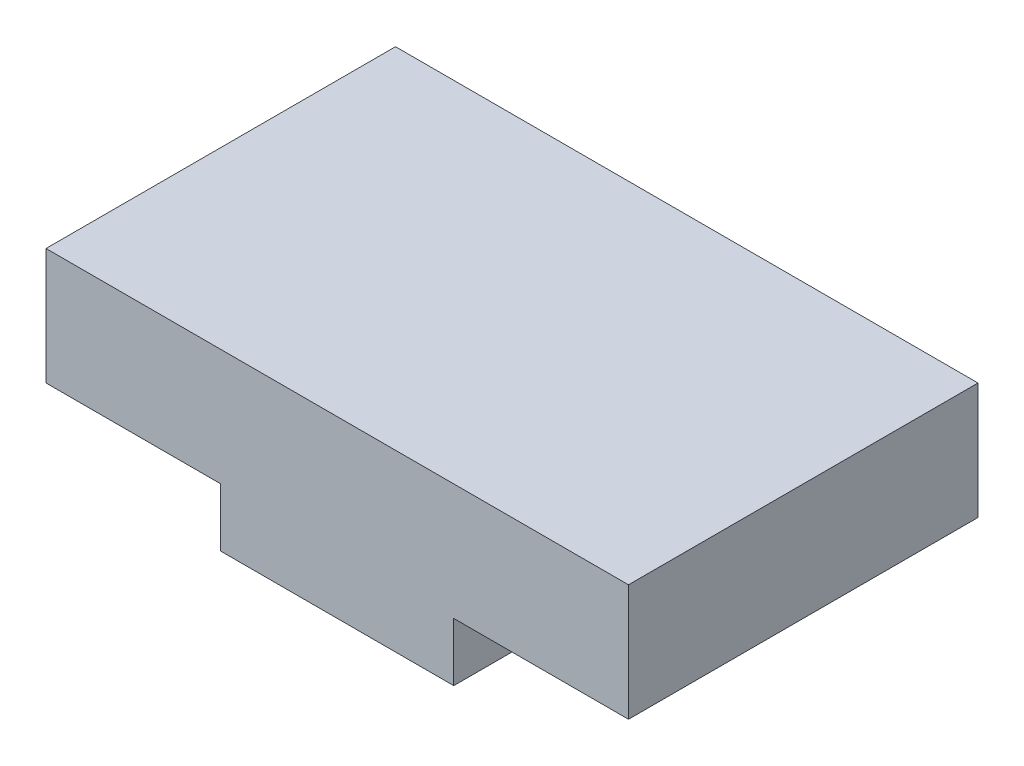
ISO-10303-21;
HEADER;
FILE_DESCRIPTION(('STEP AP214'),'2;1');
FILE_NAME('part.step','',(''),(''),'','','');
FILE_SCHEMA(('AUTOMOTIVE_DESIGN { 1 0 10303 214 1 1 1 1 }'));
ENDSEC;
DATA;
#1=APPLICATION_CONTEXT('core data for automotive mechanical design processes');
#2=APPLICATION_PROTOCOL_DEFINITION('international standard','automotive_design',2000,#1);
#3=PRODUCT_CONTEXT('',#1,'mechanical');
#4=PRODUCT('Part','Part','',(#3));
#5=PRODUCT_RELATED_PRODUCT_CATEGORY('part','',(#4));
#6=PRODUCT_DEFINITION_FORMATION('','',#4);
#7=PRODUCT_DEFINITION_CONTEXT('part definition',#1,'design');
#8=PRODUCT_DEFINITION('design','',#6,#7);
#9=PRODUCT_DEFINITION_SHAPE('','',#8);
#10=(LENGTH_UNIT() NAMED_UNIT(*) SI_UNIT(.MILLI.,.METRE.));
#11=(NAMED_UNIT(*) PLANE_ANGLE_UNIT() SI_UNIT($,.RADIAN.));
#12=(NAMED_UNIT(*) SI_UNIT($,.STERADIAN.) SOLID_ANGLE_UNIT());
#13=UNCERTAINTY_MEASURE_WITH_UNIT(LENGTH_MEASURE(1.E-05),#10,'distance_accuracy_value','');
#14=(GEOMETRIC_REPRESENTATION_CONTEXT(3) GLOBAL_UNCERTAINTY_ASSIGNED_CONTEXT((#13)) GLOBAL_UNIT_ASSIGNED_CONTEXT((#10,
#11,#12)) REPRESENTATION_CONTEXT('',''));
#15=CARTESIAN_POINT('',(0.,0.,0.));
#16=DIRECTION('',(0.,0.,1.));
#17=DIRECTION('',(1.,0.,0.));
#18=AXIS2_PLACEMENT_3D('',#15,#16,#17);
#19=CARTESIAN_POINT('',(25.,5.,15.));
#20=DIRECTION('',(-1.,0.,0.));
#21=DIRECTION('',(0.,0.,1.));
#22=AXIS2_PLACEMENT_3D('',#19,#20,#21);
#23=PLANE('',#22);
#24=DIRECTION('',(0.,1.,0.));
#25=VECTOR('',#24,1.);
#26=CARTESIAN_POINT('',(25.,5.,-15.));
#27=LINE('',#26,#25);
#28=CARTESIAN_POINT('',(25.,-5.,-15.));
#29=VERTEX_POINT('',#28);
#30=CARTESIAN_POINT('',(25.,5.,-15.));
#31=VERTEX_POINT('',#30);
#32=EDGE_CURVE('E140',#29,#31,#27,.T.);
#33=ORIENTED_EDGE('',*,*,#32,.T.);
#34=DIRECTION('',(0.,0.,-1.));
#35=VECTOR('',#34,1.);
#36=CARTESIAN_POINT('',(25.,5.,15.));
#37=LINE('',#36,#35);
#38=CARTESIAN_POINT('',(25.,5.,15.));
#39=VERTEX_POINT('',#38);
#40=EDGE_CURVE('E11',#39,#31,#37,.T.);
#41=ORIENTED_EDGE('',*,*,#40,.F.);
#42=DIRECTION('',(0.,1.,0.));
#43=VECTOR('',#42,1.);
#44=CARTESIAN_POINT('',(25.,5.,15.));
#45=LINE('',#44,#43);
#46=CARTESIAN_POINT('',(25.,-5.,15.));
#47=VERTEX_POINT('',#46);
#48=EDGE_CURVE('E162',#47,#39,#45,.T.);
#49=ORIENTED_EDGE('',*,*,#48,.F.);
#50=DIRECTION('',(0.,0.,-1.));
#51=VECTOR('',#50,1.);
#52=CARTESIAN_POINT('',(25.,-5.,15.));
#53=LINE('',#52,#51);
#54=EDGE_CURVE('E136',#47,#29,#53,.T.);
#55=ORIENTED_EDGE('',*,*,#54,.T.);
#56=EDGE_LOOP('',(#33,#41,#49,#55));
#57=FACE_BOUND('',#56,.T.);
#58=ADVANCED_FACE('F39',(#57),#23,.F.);
#59=CARTESIAN_POINT('',(-25.,5.,15.));
#60=DIRECTION('',(0.,-1.,0.));
#61=DIRECTION('',(0.,0.,-1.));
#62=AXIS2_PLACEMENT_3D('',#59,#60,#61);
#63=PLANE('',#62);
#64=DIRECTION('',(-1.,0.,0.));
#65=VECTOR('',#64,1.);
#66=CARTESIAN_POINT('',(-25.,5.,-15.));
#67=LINE('',#66,#65);
#68=CARTESIAN_POINT('',(-25.,5.,-15.));
#69=VERTEX_POINT('',#68);
#70=EDGE_CURVE('E144',#31,#69,#67,.T.);
#71=ORIENTED_EDGE('',*,*,#70,.T.);
#72=DIRECTION('',(0.,0.,-1.));
#73=VECTOR('',#72,1.);
#74=CARTESIAN_POINT('',(-25.,5.,15.));
#75=LINE('',#74,#73);
#76=CARTESIAN_POINT('',(-25.,5.,15.));
#77=VERTEX_POINT('',#76);
#78=EDGE_CURVE('E48',#77,#69,#75,.T.);
#79=ORIENTED_EDGE('',*,*,#78,.F.);
#80=DIRECTION('',(-1.,0.,0.));
#81=VECTOR('',#80,1.);
#82=CARTESIAN_POINT('',(-25.,5.,15.));
#83=LINE('',#82,#81);
#84=EDGE_CURVE('E99',#39,#77,#83,.T.);
#85=ORIENTED_EDGE('',*,*,#84,.F.);
#86=ORIENTED_EDGE('',*,*,#40,.T.);
#87=EDGE_LOOP('',(#71,#79,#85,#86));
#88=FACE_BOUND('',#87,.T.);
#89=ADVANCED_FACE('F208',(#88),#63,.F.);
#90=CARTESIAN_POINT('',(-25.,5.,15.));
#91=DIRECTION('',(1.,0.,0.));
#92=DIRECTION('',(0.,0.,-1.));
#93=AXIS2_PLACEMENT_3D('',#90,#91,#92);
#94=PLANE('',#93);
#95=DIRECTION('',(0.,-1.,0.));
#96=VECTOR('',#95,1.);
#97=CARTESIAN_POINT('',(-25.,5.,-15.));
#98=LINE('',#97,#96);
#99=CARTESIAN_POINT('',(-25.,-5.,-15.));
#100=VERTEX_POINT('',#99);
#101=EDGE_CURVE('E147',#69,#100,#98,.T.);
#102=ORIENTED_EDGE('',*,*,#101,.T.);
#103=DIRECTION('',(0.,0.,-1.));
#104=VECTOR('',#103,1.);
#105=CARTESIAN_POINT('',(-25.,-5.,15.));
#106=LINE('',#105,#104);
#107=CARTESIAN_POINT('',(-25.,-5.,15.));
#108=VERTEX_POINT('',#107);
#109=EDGE_CURVE('E173',#108,#100,#106,.T.);
#110=ORIENTED_EDGE('',*,*,#109,.F.);
#111=DIRECTION('',(0.,-1.,0.));
#112=VECTOR('',#111,1.);
#113=CARTESIAN_POINT('',(-25.,5.,15.));
#114=LINE('',#113,#112);
#115=EDGE_CURVE('E183',#77,#108,#114,.T.);
#116=ORIENTED_EDGE('',*,*,#115,.F.);
#117=ORIENTED_EDGE('',*,*,#78,.T.);
#118=EDGE_LOOP('',(#102,#110,#116,#117));
#119=FACE_BOUND('',#118,.T.);
#120=ADVANCED_FACE('F181',(#119),#94,.F.);
#121=CARTESIAN_POINT('',(-25.,-5.,15.));
#122=DIRECTION('',(0.,1.,0.));
#123=DIRECTION('',(0.,0.,1.));
#124=AXIS2_PLACEMENT_3D('',#121,#122,#123);
#125=PLANE('',#124);
#126=DIRECTION('',(1.,0.,0.));
#127=VECTOR('',#126,1.);
#128=CARTESIAN_POINT('',(-25.,-5.,-15.));
#129=LINE('',#128,#127);
#130=CARTESIAN_POINT('',(-10.,-5.,-15.));
#131=VERTEX_POINT('',#130);
#132=EDGE_CURVE('E150',#100,#131,#129,.T.);
#133=ORIENTED_EDGE('',*,*,#132,.T.);
#134=DIRECTION('',(0.,0.,-1.));
#135=VECTOR('',#134,1.);
#136=CARTESIAN_POINT('',(-10.,-5.,15.));
#137=LINE('',#136,#135);
#138=CARTESIAN_POINT('',(-10.,-5.,15.));
#139=VERTEX_POINT('',#138);
#140=EDGE_CURVE('E169',#139,#131,#137,.T.);
#141=ORIENTED_EDGE('',*,*,#140,.F.);
#142=DIRECTION('',(1.,0.,0.));
#143=VECTOR('',#142,1.);
#144=CARTESIAN_POINT('',(-25.,-5.,15.));
#145=LINE('',#144,#143);
#146=EDGE_CURVE('E196',#108,#139,#145,.T.);
#147=ORIENTED_EDGE('',*,*,#146,.F.);
#148=ORIENTED_EDGE('',*,*,#109,.T.);
#149=EDGE_LOOP('',(#133,#141,#147,#148));
#150=FACE_BOUND('',#149,.T.);
#151=ADVANCED_FACE('F191',(#150),#125,.F.);
#152=CARTESIAN_POINT('',(-10.,-5.,15.));
#153=DIRECTION('',(1.,0.,0.));
#154=DIRECTION('',(0.,0.,-1.));
#155=AXIS2_PLACEMENT_3D('',#152,#153,#154);
#156=PLANE('',#155);
#157=DIRECTION('',(0.,-1.,0.));
#158=VECTOR('',#157,1.);
#159=CARTESIAN_POINT('',(-10.,-5.,-15.));
#160=LINE('',#159,#158);
#161=CARTESIAN_POINT('',(-10.,-10.,-15.));
#162=VERTEX_POINT('',#161);
#163=EDGE_CURVE('E153',#131,#162,#160,.T.);
#164=ORIENTED_EDGE('',*,*,#163,.T.);
#165=DIRECTION('',(0.,0.,-1.));
#166=VECTOR('',#165,1.);
#167=CARTESIAN_POINT('',(-10.,-10.,15.));
#168=LINE('',#167,#166);
#169=CARTESIAN_POINT('',(-10.,-10.,15.));
#170=VERTEX_POINT('',#169);
#171=EDGE_CURVE('E129',#170,#162,#168,.T.);
#172=ORIENTED_EDGE('',*,*,#171,.F.);
#173=DIRECTION('',(0.,-1.,0.));
#174=VECTOR('',#173,1.);
#175=CARTESIAN_POINT('',(-10.,-5.,15.));
#176=LINE('',#175,#174);
#177=EDGE_CURVE('E118',#139,#170,#176,.T.);
#178=ORIENTED_EDGE('',*,*,#177,.F.);
#179=ORIENTED_EDGE('',*,*,#140,.T.);
#180=EDGE_LOOP('',(#164,#172,#178,#179));
#181=FACE_BOUND('',#180,.T.);
#182=ADVANCED_FACE('F194',(#181),#156,.F.);
#183=CARTESIAN_POINT('',(-10.,-10.,15.));
#184=DIRECTION('',(0.,1.,0.));
#185=DIRECTION('',(0.,0.,1.));
#186=AXIS2_PLACEMENT_3D('',#183,#184,#185);
#187=PLANE('',#186);
#188=DIRECTION('',(1.,0.,0.));
#189=VECTOR('',#188,1.);
#190=CARTESIAN_POINT('',(-10.,-10.,-15.));
#191=LINE('',#190,#189);
#192=CARTESIAN_POINT('',(10.,-10.,-15.));
#193=VERTEX_POINT('',#192);
#194=EDGE_CURVE('E127',#162,#193,#191,.T.);
#195=ORIENTED_EDGE('',*,*,#194,.T.);
#196=DIRECTION('',(0.,0.,-1.));
#197=VECTOR('',#196,1.);
#198=CARTESIAN_POINT('',(10.,-10.,15.));
#199=LINE('',#198,#197);
#200=CARTESIAN_POINT('',(10.,-10.,15.));
#201=VERTEX_POINT('',#200);
#202=EDGE_CURVE('E124',#201,#193,#199,.T.);
#203=ORIENTED_EDGE('',*,*,#202,.F.);
#204=DIRECTION('',(1.,0.,0.));
#205=VECTOR('',#204,1.);
#206=CARTESIAN_POINT('',(-10.,-10.,15.));
#207=LINE('',#206,#205);
#208=EDGE_CURVE('E112',#170,#201,#207,.T.);
#209=ORIENTED_EDGE('',*,*,#208,.F.);
#210=ORIENTED_EDGE('',*,*,#171,.T.);
#211=EDGE_LOOP('',(#195,#203,#209,#210));
#212=FACE_BOUND('',#211,.T.);
#213=ADVANCED_FACE('F125',(#212),#187,.F.);
#214=CARTESIAN_POINT('',(10.,-5.,15.));
#215=DIRECTION('',(-1.,0.,0.));
#216=DIRECTION('',(0.,0.,1.));
#217=AXIS2_PLACEMENT_3D('',#214,#215,#216);
#218=PLANE('',#217);
#219=DIRECTION('',(0.,1.,0.));
#220=VECTOR('',#219,1.);
#221=CARTESIAN_POINT('',(10.,-5.,-15.));
#222=LINE('',#221,#220);
#223=CARTESIAN_POINT('',(10.,-5.,-15.));
#224=VERTEX_POINT('',#223);
#225=EDGE_CURVE('E85',#193,#224,#222,.T.);
#226=ORIENTED_EDGE('',*,*,#225,.T.);
#227=DIRECTION('',(0.,0.,-1.));
#228=VECTOR('',#227,1.);
#229=CARTESIAN_POINT('',(10.,-5.,15.));
#230=LINE('',#229,#228);
#231=CARTESIAN_POINT('',(10.,-5.,15.));
#232=VERTEX_POINT('',#231);
#233=EDGE_CURVE('E130',#232,#224,#230,.T.);
#234=ORIENTED_EDGE('',*,*,#233,.F.);
#235=DIRECTION('',(0.,1.,0.));
#236=VECTOR('',#235,1.);
#237=CARTESIAN_POINT('',(10.,-5.,15.));
#238=LINE('',#237,#236);
#239=EDGE_CURVE('E116',#201,#232,#238,.T.);
#240=ORIENTED_EDGE('',*,*,#239,.F.);
#241=ORIENTED_EDGE('',*,*,#202,.T.);
#242=EDGE_LOOP('',(#226,#234,#240,#241));
#243=FACE_BOUND('',#242,.T.);
#244=ADVANCED_FACE('F132',(#243),#218,.F.);
#245=CARTESIAN_POINT('',(10.,-5.,15.));
#246=DIRECTION('',(0.,1.,0.));
#247=DIRECTION('',(0.,0.,1.));
#248=AXIS2_PLACEMENT_3D('',#245,#246,#247);
#249=PLANE('',#248);
#250=DIRECTION('',(1.,0.,0.));
#251=VECTOR('',#250,1.);
#252=CARTESIAN_POINT('',(10.,-5.,-15.));
#253=LINE('',#252,#251);
#254=EDGE_CURVE('E91',#224,#29,#253,.T.);
#255=ORIENTED_EDGE('',*,*,#254,.T.);
#256=ORIENTED_EDGE('',*,*,#54,.F.);
#257=DIRECTION('',(1.,0.,0.));
#258=VECTOR('',#257,1.);
#259=CARTESIAN_POINT('',(10.,-5.,15.));
#260=LINE('',#259,#258);
#261=EDGE_CURVE('E56',#232,#47,#260,.T.);
#262=ORIENTED_EDGE('',*,*,#261,.F.);
#263=ORIENTED_EDGE('',*,*,#233,.T.);
#264=EDGE_LOOP('',(#255,#256,#262,#263));
#265=FACE_BOUND('',#264,.T.);
#266=ADVANCED_FACE('F224',(#265),#249,.F.);
#267=CARTESIAN_POINT('',(0.,0.,15.));
#268=DIRECTION('',(0.,0.,1.));
#269=DIRECTION('',(1.,0.,0.));
#270=AXIS2_PLACEMENT_3D('',#267,#268,#269);
#271=PLANE('',#270);
#272=ORIENTED_EDGE('',*,*,#48,.T.);
#273=ORIENTED_EDGE('',*,*,#84,.T.);
#274=ORIENTED_EDGE('',*,*,#115,.T.);
#275=ORIENTED_EDGE('',*,*,#146,.T.);
#276=ORIENTED_EDGE('',*,*,#177,.T.);
#277=ORIENTED_EDGE('',*,*,#208,.T.);
#278=ORIENTED_EDGE('',*,*,#239,.T.);
#279=ORIENTED_EDGE('',*,*,#261,.T.);
#280=EDGE_LOOP('',(#272,#273,#274,#275,#276,#277,#278,#279));
#281=FACE_BOUND('',#280,.T.);
#282=ADVANCED_FACE('F114',(#281),#271,.T.);
#283=CARTESIAN_POINT('',(0.,0.,-15.));
#284=DIRECTION('',(0.,0.,1.));
#285=DIRECTION('',(1.,0.,0.));
#286=AXIS2_PLACEMENT_3D('',#283,#284,#285);
#287=PLANE('',#286);
#288=ORIENTED_EDGE('',*,*,#32,.F.);
#289=ORIENTED_EDGE('',*,*,#254,.F.);
#290=ORIENTED_EDGE('',*,*,#225,.F.);
#291=ORIENTED_EDGE('',*,*,#194,.F.);
#292=ORIENTED_EDGE('',*,*,#163,.F.);
#293=ORIENTED_EDGE('',*,*,#132,.F.);
#294=ORIENTED_EDGE('',*,*,#101,.F.);
#295=ORIENTED_EDGE('',*,*,#70,.F.);
#296=EDGE_LOOP('',(#288,#289,#290,#291,#292,#293,#294,#295));
#297=FACE_BOUND('',#296,.T.);
#298=ADVANCED_FACE('F187',(#297),#287,.F.);
#299=CLOSED_SHELL('',(#58,#89,#120,#151,#182,#213,#244,#266,#282,#298));
#300=MANIFOLD_SOLID_BREP('B2',#299);
#301=ADVANCED_BREP_SHAPE_REPRESENTATION('',(#18,#300),#14);
#302=SHAPE_DEFINITION_REPRESENTATION(#9,#301);
ENDSEC;
END-ISO-10303-21;
